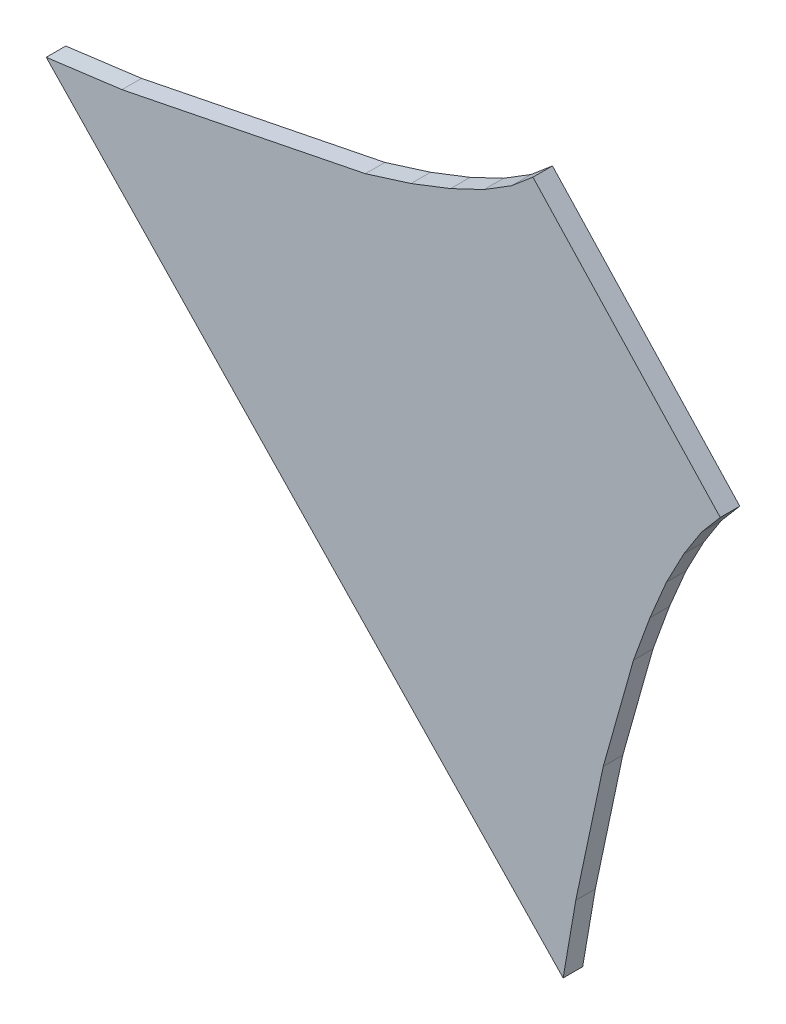
ISO-10303-21;
HEADER;
FILE_DESCRIPTION(('STEP AP214'),'2;1');
FILE_NAME('part.step','',(''),(''),'','','');
FILE_SCHEMA(('AUTOMOTIVE_DESIGN { 1 0 10303 214 1 1 1 1 }'));
ENDSEC;
DATA;
#1=APPLICATION_CONTEXT('core data for automotive mechanical design processes');
#2=APPLICATION_PROTOCOL_DEFINITION('international standard','automotive_design',2000,#1);
#3=PRODUCT_CONTEXT('',#1,'mechanical');
#4=PRODUCT('Part','Part','',(#3));
#5=PRODUCT_RELATED_PRODUCT_CATEGORY('part','',(#4));
#6=PRODUCT_DEFINITION_FORMATION('','',#4);
#7=PRODUCT_DEFINITION_CONTEXT('part definition',#1,'design');
#8=PRODUCT_DEFINITION('design','',#6,#7);
#9=PRODUCT_DEFINITION_SHAPE('','',#8);
#10=(LENGTH_UNIT() NAMED_UNIT(*) SI_UNIT(.MILLI.,.METRE.));
#11=(NAMED_UNIT(*) PLANE_ANGLE_UNIT() SI_UNIT($,.RADIAN.));
#12=(NAMED_UNIT(*) SI_UNIT($,.STERADIAN.) SOLID_ANGLE_UNIT());
#13=UNCERTAINTY_MEASURE_WITH_UNIT(LENGTH_MEASURE(1.E-05),#10,'distance_accuracy_value','');
#14=(GEOMETRIC_REPRESENTATION_CONTEXT(3) GLOBAL_UNCERTAINTY_ASSIGNED_CONTEXT((#13)) GLOBAL_UNIT_ASSIGNED_CONTEXT((#10,
#11,#12)) REPRESENTATION_CONTEXT('',''));
#15=CARTESIAN_POINT('',(0.,0.,0.));
#16=DIRECTION('',(0.,0.,1.));
#17=DIRECTION('',(1.,0.,0.));
#18=AXIS2_PLACEMENT_3D('',#15,#16,#17);
#19=CARTESIAN_POINT('',(40.1839981079102,99.6380004882812,0.));
#20=DIRECTION('',(0.645932199012131,-0.76339478271688,0.));
#21=DIRECTION('',(-0.76339478271688,-0.645932199012131,0.));
#22=AXIS2_PLACEMENT_3D('',#19,#20,#21);
#23=PLANE('',#22);
#24=DIRECTION('',(-0.76339478271688,-0.645932199012131,0.));
#25=VECTOR('',#24,1.);
#26=CARTESIAN_POINT('',(40.1839981079102,99.6380004882812,0.03556));
#27=LINE('',#26,#25);
#28=CARTESIAN_POINT('',(40.1839981079102,99.6380004882812,0.03556));
#29=VERTEX_POINT('',#28);
#30=CARTESIAN_POINT('',(40.1450004577637,99.6050033569336,0.03556));
#31=VERTEX_POINT('',#30);
#32=EDGE_CURVE('E11',#29,#31,#27,.T.);
#33=ORIENTED_EDGE('',*,*,#32,.F.);
#34=DIRECTION('',(0.,0.,1.));
#35=VECTOR('',#34,1.);
#36=CARTESIAN_POINT('',(40.1839981079102,99.6380004882812,0.));
#37=LINE('',#36,#35);
#38=CARTESIAN_POINT('',(40.1839981079102,99.6380004882812,0.));
#39=VERTEX_POINT('',#38);
#40=EDGE_CURVE('E24',#39,#29,#37,.T.);
#41=ORIENTED_EDGE('',*,*,#40,.F.);
#42=DIRECTION('',(-0.76339478271688,-0.645932199012131,0.));
#43=VECTOR('',#42,1.);
#44=CARTESIAN_POINT('',(40.1839981079102,99.6380004882812,0.));
#45=LINE('',#44,#43);
#46=CARTESIAN_POINT('',(40.1450004577637,99.6050033569336,0.));
#47=VERTEX_POINT('',#46);
#48=EDGE_CURVE('E154',#39,#47,#45,.T.);
#49=ORIENTED_EDGE('',*,*,#48,.T.);
#50=DIRECTION('',(0.,0.,1.));
#51=VECTOR('',#50,1.);
#52=CARTESIAN_POINT('',(40.1450004577637,99.6050033569336,0.));
#53=LINE('',#52,#51);
#54=EDGE_CURVE('E37',#47,#31,#53,.T.);
#55=ORIENTED_EDGE('',*,*,#54,.T.);
#56=EDGE_LOOP('',(#33,#41,#49,#55));
#57=FACE_BOUND('',#56,.T.);
#58=ADVANCED_FACE('F17',(#57),#23,.F.);
#59=CARTESIAN_POINT('',(40.1450004577637,99.6050033569336,0.));
#60=DIRECTION('',(0.527017414395951,-0.849854484558037,0.));
#61=DIRECTION('',(-0.849854484558037,-0.527017414395951,0.));
#62=AXIS2_PLACEMENT_3D('',#59,#60,#61);
#63=PLANE('',#62);
#64=DIRECTION('',(-0.849854484558037,-0.527017414395951,0.));
#65=VECTOR('',#64,1.);
#66=CARTESIAN_POINT('',(40.1450004577637,99.6050033569336,0.03556));
#67=LINE('',#66,#65);
#68=CARTESIAN_POINT('',(40.0950012207031,99.5739974975586,0.03556));
#69=VERTEX_POINT('',#68);
#70=EDGE_CURVE('E266',#31,#69,#67,.T.);
#71=ORIENTED_EDGE('',*,*,#70,.F.);
#72=ORIENTED_EDGE('',*,*,#54,.F.);
#73=DIRECTION('',(-0.849854484558037,-0.527017414395951,0.));
#74=VECTOR('',#73,1.);
#75=CARTESIAN_POINT('',(40.1450004577637,99.6050033569336,0.));
#76=LINE('',#75,#74);
#77=CARTESIAN_POINT('',(40.0950012207031,99.5739974975586,0.));
#78=VERTEX_POINT('',#77);
#79=EDGE_CURVE('E263',#47,#78,#76,.T.);
#80=ORIENTED_EDGE('',*,*,#79,.T.);
#81=DIRECTION('',(0.,0.,1.));
#82=VECTOR('',#81,1.);
#83=CARTESIAN_POINT('',(40.0950012207031,99.5739974975586,0.));
#84=LINE('',#83,#82);
#85=EDGE_CURVE('E261',#78,#69,#84,.T.);
#86=ORIENTED_EDGE('',*,*,#85,.T.);
#87=EDGE_LOOP('',(#71,#72,#80,#86));
#88=FACE_BOUND('',#87,.T.);
#89=ADVANCED_FACE('F274',(#88),#63,.F.);
#90=CARTESIAN_POINT('',(40.0950012207031,99.5739974975586,0.));
#91=DIRECTION('',(0.429345950858974,-0.903140107890799,0.));
#92=DIRECTION('',(-0.903140107890799,-0.429345950858974,0.));
#93=AXIS2_PLACEMENT_3D('',#90,#91,#92);
#94=PLANE('',#93);
#95=DIRECTION('',(-0.903140107890799,-0.429345950858974,0.));
#96=VECTOR('',#95,1.);
#97=CARTESIAN_POINT('',(40.0950012207031,99.5739974975586,0.03556));
#98=LINE('',#97,#96);
#99=CARTESIAN_POINT('',(40.0340003967285,99.5449981689453,0.03556));
#100=VERTEX_POINT('',#99);
#101=EDGE_CURVE('E258',#69,#100,#98,.T.);
#102=ORIENTED_EDGE('',*,*,#101,.F.);
#103=ORIENTED_EDGE('',*,*,#85,.F.);
#104=DIRECTION('',(-0.903140107890799,-0.429345950858974,0.));
#105=VECTOR('',#104,1.);
#106=CARTESIAN_POINT('',(40.0950012207031,99.5739974975586,0.));
#107=LINE('',#106,#105);
#108=CARTESIAN_POINT('',(40.0340003967285,99.5449981689453,0.));
#109=VERTEX_POINT('',#108);
#110=EDGE_CURVE('E255',#78,#109,#107,.T.);
#111=ORIENTED_EDGE('',*,*,#110,.T.);
#112=DIRECTION('',(0.,0.,1.));
#113=VECTOR('',#112,1.);
#114=CARTESIAN_POINT('',(40.0340003967285,99.5449981689453,0.));
#115=LINE('',#114,#113);
#116=EDGE_CURVE('E253',#109,#100,#115,.T.);
#117=ORIENTED_EDGE('',*,*,#116,.T.);
#118=EDGE_LOOP('',(#102,#103,#111,#117));
#119=FACE_BOUND('',#118,.T.);
#120=ADVANCED_FACE('F280',(#119),#94,.F.);
#121=CARTESIAN_POINT('',(40.0340003967285,99.5449981689453,0.));
#122=DIRECTION('',(0.362451027072357,-0.932002818114942,0.));
#123=DIRECTION('',(-0.932002818114942,-0.362451027072357,0.));
#124=AXIS2_PLACEMENT_3D('',#121,#122,#123);
#125=PLANE('',#124);
#126=DIRECTION('',(-0.932002818114942,-0.362451027072357,0.));
#127=VECTOR('',#126,1.);
#128=CARTESIAN_POINT('',(40.0340003967285,99.5449981689453,0.03556));
#129=LINE('',#128,#127);
#130=CARTESIAN_POINT('',(39.9620018005371,99.5169982910156,0.03556));
#131=VERTEX_POINT('',#130);
#132=EDGE_CURVE('E250',#100,#131,#129,.T.);
#133=ORIENTED_EDGE('',*,*,#132,.F.);
#134=ORIENTED_EDGE('',*,*,#116,.F.);
#135=DIRECTION('',(-0.932002818114942,-0.362451027072357,0.));
#136=VECTOR('',#135,1.);
#137=CARTESIAN_POINT('',(40.0340003967285,99.5449981689453,0.));
#138=LINE('',#137,#136);
#139=CARTESIAN_POINT('',(39.9620018005371,99.5169982910156,0.));
#140=VERTEX_POINT('',#139);
#141=EDGE_CURVE('E247',#109,#140,#138,.T.);
#142=ORIENTED_EDGE('',*,*,#141,.T.);
#143=DIRECTION('',(0.,0.,1.));
#144=VECTOR('',#143,1.);
#145=CARTESIAN_POINT('',(39.9620018005371,99.5169982910156,0.));
#146=LINE('',#145,#144);
#147=EDGE_CURVE('E245',#140,#131,#146,.T.);
#148=ORIENTED_EDGE('',*,*,#147,.T.);
#149=EDGE_LOOP('',(#133,#134,#142,#148));
#150=FACE_BOUND('',#149,.T.);
#151=ADVANCED_FACE('F282',(#150),#125,.F.);
#152=CARTESIAN_POINT('',(39.9620018005371,99.5169982910156,0.));
#153=DIRECTION('',(0.298939196929958,-0.954272160622363,0.));
#154=DIRECTION('',(-0.954272160622363,-0.298939196929958,0.));
#155=AXIS2_PLACEMENT_3D('',#152,#153,#154);
#156=PLANE('',#155);
#157=DIRECTION('',(-0.954272160622362,-0.298939196929958,0.));
#158=VECTOR('',#157,1.);
#159=CARTESIAN_POINT('',(39.9620018005371,99.5169982910156,0.03556));
#160=LINE('',#159,#158);
#161=CARTESIAN_POINT('',(39.8790016174316,99.4909973144531,0.03556));
#162=VERTEX_POINT('',#161);
#163=EDGE_CURVE('E242',#131,#162,#160,.T.);
#164=ORIENTED_EDGE('',*,*,#163,.F.);
#165=ORIENTED_EDGE('',*,*,#147,.F.);
#166=DIRECTION('',(-0.954272160622362,-0.298939196929958,0.));
#167=VECTOR('',#166,1.);
#168=CARTESIAN_POINT('',(39.9620018005371,99.5169982910156,0.));
#169=LINE('',#168,#167);
#170=CARTESIAN_POINT('',(39.8790016174316,99.4909973144531,0.));
#171=VERTEX_POINT('',#170);
#172=EDGE_CURVE('E239',#140,#171,#169,.T.);
#173=ORIENTED_EDGE('',*,*,#172,.T.);
#174=DIRECTION('',(0.,0.,1.));
#175=VECTOR('',#174,1.);
#176=CARTESIAN_POINT('',(39.8790016174316,99.4909973144531,0.));
#177=LINE('',#176,#175);
#178=EDGE_CURVE('E237',#171,#162,#177,.T.);
#179=ORIENTED_EDGE('',*,*,#178,.T.);
#180=EDGE_LOOP('',(#164,#165,#173,#179));
#181=FACE_BOUND('',#180,.T.);
#182=ADVANCED_FACE('F287',(#181),#156,.F.);
#183=CARTESIAN_POINT('',(39.8790016174317,99.4909973144531,0.));
#184=DIRECTION('',(0.196960298623905,-0.980411465031893,0.));
#185=DIRECTION('',(-0.980411465031893,-0.196960298623905,0.));
#186=AXIS2_PLACEMENT_3D('',#183,#184,#185);
#187=PLANE('',#186);
#188=DIRECTION('',(-0.980411465031893,-0.196960298623905,0.));
#189=VECTOR('',#188,1.);
#190=CARTESIAN_POINT('',(39.8790016174316,99.4909973144531,0.03556));
#191=LINE('',#190,#189);
#192=CARTESIAN_POINT('',(39.4360008239746,99.4020004272461,0.03556));
#193=VERTEX_POINT('',#192);
#194=EDGE_CURVE('E234',#162,#193,#191,.T.);
#195=ORIENTED_EDGE('',*,*,#194,.F.);
#196=ORIENTED_EDGE('',*,*,#178,.F.);
#197=DIRECTION('',(-0.980411465031893,-0.196960298623905,0.));
#198=VECTOR('',#197,1.);
#199=CARTESIAN_POINT('',(39.8790016174316,99.4909973144531,0.));
#200=LINE('',#199,#198);
#201=CARTESIAN_POINT('',(39.4360008239746,99.4020004272461,0.));
#202=VERTEX_POINT('',#201);
#203=EDGE_CURVE('E231',#171,#202,#200,.T.);
#204=ORIENTED_EDGE('',*,*,#203,.T.);
#205=DIRECTION('',(0.,0.,1.));
#206=VECTOR('',#205,1.);
#207=CARTESIAN_POINT('',(39.4360008239746,99.4020004272461,0.));
#208=LINE('',#207,#206);
#209=EDGE_CURVE('E229',#202,#193,#208,.T.);
#210=ORIENTED_EDGE('',*,*,#209,.T.);
#211=EDGE_LOOP('',(#195,#196,#204,#210));
#212=FACE_BOUND('',#211,.T.);
#213=ADVANCED_FACE('F290',(#212),#187,.F.);
#214=CARTESIAN_POINT('',(39.4360008239746,99.4020004272461,0.));
#215=DIRECTION('',(0.129322778504163,-0.991602550904324,0.));
#216=DIRECTION('',(-0.991602550904324,-0.129322778504163,0.));
#217=AXIS2_PLACEMENT_3D('',#214,#215,#216);
#218=PLANE('',#217);
#219=DIRECTION('',(-0.991602550904324,-0.129322778504163,0.));
#220=VECTOR('',#219,1.);
#221=CARTESIAN_POINT('',(39.4360008239746,99.4020004272461,0.03556));
#222=LINE('',#221,#220);
#223=CARTESIAN_POINT('',(39.2980003356934,99.3840026855469,0.03556));
#224=VERTEX_POINT('',#223);
#225=EDGE_CURVE('E226',#193,#224,#222,.T.);
#226=ORIENTED_EDGE('',*,*,#225,.F.);
#227=ORIENTED_EDGE('',*,*,#209,.F.);
#228=DIRECTION('',(-0.991602550904324,-0.129322778504163,0.));
#229=VECTOR('',#228,1.);
#230=CARTESIAN_POINT('',(39.4360008239746,99.4020004272461,0.));
#231=LINE('',#230,#229);
#232=CARTESIAN_POINT('',(39.2980003356934,99.3840026855469,0.));
#233=VERTEX_POINT('',#232);
#234=EDGE_CURVE('E223',#202,#233,#231,.T.);
#235=ORIENTED_EDGE('',*,*,#234,.T.);
#236=DIRECTION('',(0.,0.,1.));
#237=VECTOR('',#236,1.);
#238=CARTESIAN_POINT('',(39.2980003356934,99.3840026855469,0.));
#239=LINE('',#238,#237);
#240=EDGE_CURVE('E221',#233,#224,#239,.T.);
#241=ORIENTED_EDGE('',*,*,#240,.T.);
#242=EDGE_LOOP('',(#226,#227,#235,#241));
#243=FACE_BOUND('',#242,.T.);
#244=ADVANCED_FACE('F295',(#243),#218,.F.);
#245=CARTESIAN_POINT('',(39.2980003356934,99.3840026855469,0.));
#246=DIRECTION('',(0.721668270543544,0.692239053572312,0.));
#247=DIRECTION('',(0.692239053572312,-0.721668270543544,0.));
#248=AXIS2_PLACEMENT_3D('',#245,#246,#247);
#249=PLANE('',#248);
#250=DIRECTION('',(0.692239053572312,-0.721668270543544,0.));
#251=VECTOR('',#250,1.);
#252=CARTESIAN_POINT('',(39.2980003356934,99.3840026855469,0.03556));
#253=LINE('',#252,#251);
#254=CARTESIAN_POINT('',(40.2389984130859,98.4029998779297,0.03556));
#255=VERTEX_POINT('',#254);
#256=EDGE_CURVE('E218',#224,#255,#253,.T.);
#257=ORIENTED_EDGE('',*,*,#256,.F.);
#258=ORIENTED_EDGE('',*,*,#240,.F.);
#259=DIRECTION('',(0.692239053572312,-0.721668270543544,0.));
#260=VECTOR('',#259,1.);
#261=CARTESIAN_POINT('',(39.2980003356934,99.3840026855469,0.));
#262=LINE('',#261,#260);
#263=CARTESIAN_POINT('',(40.2389984130859,98.4029998779297,0.));
#264=VERTEX_POINT('',#263);
#265=EDGE_CURVE('E215',#233,#264,#262,.T.);
#266=ORIENTED_EDGE('',*,*,#265,.T.);
#267=DIRECTION('',(0.,0.,1.));
#268=VECTOR('',#267,1.);
#269=CARTESIAN_POINT('',(40.2389984130859,98.4029998779297,0.));
#270=LINE('',#269,#268);
#271=EDGE_CURVE('E213',#264,#255,#270,.T.);
#272=ORIENTED_EDGE('',*,*,#271,.T.);
#273=EDGE_LOOP('',(#257,#258,#266,#272));
#274=FACE_BOUND('',#273,.T.);
#275=ADVANCED_FACE('F298',(#274),#249,.F.);
#276=CARTESIAN_POINT('',(40.2389984130859,98.4029998779297,0.));
#277=DIRECTION('',(-0.985584583749153,0.169183416078553,0.));
#278=DIRECTION('',(0.169183416078553,0.985584583749153,0.));
#279=AXIS2_PLACEMENT_3D('',#276,#277,#278);
#280=PLANE('',#279);
#281=DIRECTION('',(0.169183416078553,0.985584583749153,0.));
#282=VECTOR('',#281,1.);
#283=CARTESIAN_POINT('',(40.2389984130859,98.4029998779297,0.03556));
#284=LINE('',#283,#282);
#285=CARTESIAN_POINT('',(40.2620010375976,98.5370025634766,0.03556));
#286=VERTEX_POINT('',#285);
#287=EDGE_CURVE('E210',#255,#286,#284,.T.);
#288=ORIENTED_EDGE('',*,*,#287,.F.);
#289=ORIENTED_EDGE('',*,*,#271,.F.);
#290=DIRECTION('',(0.169183416078553,0.985584583749153,0.));
#291=VECTOR('',#290,1.);
#292=CARTESIAN_POINT('',(40.2389984130859,98.4029998779297,0.));
#293=LINE('',#292,#291);
#294=CARTESIAN_POINT('',(40.2620010375976,98.5370025634766,0.));
#295=VERTEX_POINT('',#294);
#296=EDGE_CURVE('E207',#264,#295,#293,.T.);
#297=ORIENTED_EDGE('',*,*,#296,.T.);
#298=DIRECTION('',(0.,0.,1.));
#299=VECTOR('',#298,1.);
#300=CARTESIAN_POINT('',(40.2620010375976,98.5370025634766,0.));
#301=LINE('',#300,#299);
#302=EDGE_CURVE('E205',#295,#286,#301,.T.);
#303=ORIENTED_EDGE('',*,*,#302,.T.);
#304=EDGE_LOOP('',(#288,#289,#297,#303));
#305=FACE_BOUND('',#304,.T.);
#306=ADVANCED_FACE('F303',(#305),#280,.F.);
#307=CARTESIAN_POINT('',(40.2620010375977,98.5370025634766,0.));
#308=DIRECTION('',(-0.978285744045442,0.207260712624117,0.));
#309=DIRECTION('',(0.207260712624117,0.978285744045442,0.));
#310=AXIS2_PLACEMENT_3D('',#307,#308,#309);
#311=PLANE('',#310);
#312=DIRECTION('',(0.207260712624117,0.978285744045442,0.));
#313=VECTOR('',#312,1.);
#314=CARTESIAN_POINT('',(40.2620010375976,98.5370025634766,0.03556));
#315=LINE('',#314,#313);
#316=CARTESIAN_POINT('',(40.3120002746582,98.7730026245117,0.03556));
#317=VERTEX_POINT('',#316);
#318=EDGE_CURVE('E202',#286,#317,#315,.T.);
#319=ORIENTED_EDGE('',*,*,#318,.F.);
#320=ORIENTED_EDGE('',*,*,#302,.F.);
#321=DIRECTION('',(0.207260712624117,0.978285744045442,0.));
#322=VECTOR('',#321,1.);
#323=CARTESIAN_POINT('',(40.2620010375976,98.5370025634766,0.));
#324=LINE('',#323,#322);
#325=CARTESIAN_POINT('',(40.3120002746582,98.7730026245117,0.));
#326=VERTEX_POINT('',#325);
#327=EDGE_CURVE('E199',#295,#326,#324,.T.);
#328=ORIENTED_EDGE('',*,*,#327,.T.);
#329=DIRECTION('',(0.,0.,1.));
#330=VECTOR('',#329,1.);
#331=CARTESIAN_POINT('',(40.3120002746582,98.7730026245117,0.));
#332=LINE('',#331,#330);
#333=EDGE_CURVE('E197',#326,#317,#332,.T.);
#334=ORIENTED_EDGE('',*,*,#333,.T.);
#335=EDGE_LOOP('',(#319,#320,#328,#334));
#336=FACE_BOUND('',#335,.T.);
#337=ADVANCED_FACE('F306',(#336),#311,.F.);
#338=CARTESIAN_POINT('',(40.3120002746582,98.7730026245117,0.));
#339=DIRECTION('',(-0.962449171458833,0.271461953795013,0.));
#340=DIRECTION('',(0.271461953795013,0.962449171458833,0.));
#341=AXIS2_PLACEMENT_3D('',#338,#339,#340);
#342=PLANE('',#341);
#343=DIRECTION('',(0.271461953795013,0.962449171458833,0.));
#344=VECTOR('',#343,1.);
#345=CARTESIAN_POINT('',(40.3120002746582,98.7730026245117,0.03556));
#346=LINE('',#345,#344);
#347=CARTESIAN_POINT('',(40.367000579834,98.9680023193359,0.03556));
#348=VERTEX_POINT('',#347);
#349=EDGE_CURVE('E194',#317,#348,#346,.T.);
#350=ORIENTED_EDGE('',*,*,#349,.F.);
#351=ORIENTED_EDGE('',*,*,#333,.F.);
#352=DIRECTION('',(0.271461953795013,0.962449171458833,0.));
#353=VECTOR('',#352,1.);
#354=CARTESIAN_POINT('',(40.3120002746582,98.7730026245117,0.));
#355=LINE('',#354,#353);
#356=CARTESIAN_POINT('',(40.367000579834,98.9680023193359,0.));
#357=VERTEX_POINT('',#356);
#358=EDGE_CURVE('E191',#326,#357,#355,.T.);
#359=ORIENTED_EDGE('',*,*,#358,.T.);
#360=DIRECTION('',(0.,0.,1.));
#361=VECTOR('',#360,1.);
#362=CARTESIAN_POINT('',(40.367000579834,98.9680023193359,0.));
#363=LINE('',#362,#361);
#364=EDGE_CURVE('E189',#357,#348,#363,.T.);
#365=ORIENTED_EDGE('',*,*,#364,.T.);
#366=EDGE_LOOP('',(#350,#351,#359,#365));
#367=FACE_BOUND('',#366,.T.);
#368=ADVANCED_FACE('F311',(#367),#342,.F.);
#369=CARTESIAN_POINT('',(40.367000579834,98.968002319336,0.));
#370=DIRECTION('',(-0.939128353177272,0.343566494668128,0.));
#371=DIRECTION('',(0.343566494668128,0.939128353177272,0.));
#372=AXIS2_PLACEMENT_3D('',#369,#370,#371);
#373=PLANE('',#372);
#374=DIRECTION('',(0.343566494668128,0.939128353177272,0.));
#375=VECTOR('',#374,1.);
#376=CARTESIAN_POINT('',(40.367000579834,98.9680023193359,0.03556));
#377=LINE('',#376,#375);
#378=CARTESIAN_POINT('',(40.3969993591309,99.0500030517578,0.03556));
#379=VERTEX_POINT('',#378);
#380=EDGE_CURVE('E186',#348,#379,#377,.T.);
#381=ORIENTED_EDGE('',*,*,#380,.F.);
#382=ORIENTED_EDGE('',*,*,#364,.F.);
#383=DIRECTION('',(0.343566494668128,0.939128353177272,0.));
#384=VECTOR('',#383,1.);
#385=CARTESIAN_POINT('',(40.367000579834,98.9680023193359,0.));
#386=LINE('',#385,#384);
#387=CARTESIAN_POINT('',(40.3969993591309,99.0500030517578,0.));
#388=VERTEX_POINT('',#387);
#389=EDGE_CURVE('E183',#357,#388,#386,.T.);
#390=ORIENTED_EDGE('',*,*,#389,.T.);
#391=DIRECTION('',(0.,0.,1.));
#392=VECTOR('',#391,1.);
#393=CARTESIAN_POINT('',(40.3969993591309,99.0500030517578,0.));
#394=LINE('',#393,#392);
#395=EDGE_CURVE('E181',#388,#379,#394,.T.);
#396=ORIENTED_EDGE('',*,*,#395,.T.);
#397=EDGE_LOOP('',(#381,#382,#390,#396));
#398=FACE_BOUND('',#397,.T.);
#399=ADVANCED_FACE('F314',(#398),#373,.F.);
#400=CARTESIAN_POINT('',(40.3969993591309,99.0500030517578,0.));
#401=DIRECTION('',(-0.921150214947862,0.389207247493552,0.));
#402=DIRECTION('',(0.389207247493552,0.921150214947862,0.));
#403=AXIS2_PLACEMENT_3D('',#400,#401,#402);
#404=PLANE('',#403);
#405=DIRECTION('',(0.389207247493552,0.921150214947862,0.));
#406=VECTOR('',#405,1.);
#407=CARTESIAN_POINT('',(40.3969993591309,99.0500030517578,0.03556));
#408=LINE('',#407,#406);
#409=CARTESIAN_POINT('',(40.4269981384277,99.1210021972656,0.03556));
#410=VERTEX_POINT('',#409);
#411=EDGE_CURVE('E178',#379,#410,#408,.T.);
#412=ORIENTED_EDGE('',*,*,#411,.F.);
#413=ORIENTED_EDGE('',*,*,#395,.F.);
#414=DIRECTION('',(0.389207247493552,0.921150214947862,0.));
#415=VECTOR('',#414,1.);
#416=CARTESIAN_POINT('',(40.3969993591309,99.0500030517578,0.));
#417=LINE('',#416,#415);
#418=CARTESIAN_POINT('',(40.4269981384277,99.1210021972656,0.));
#419=VERTEX_POINT('',#418);
#420=EDGE_CURVE('E175',#388,#419,#417,.T.);
#421=ORIENTED_EDGE('',*,*,#420,.T.);
#422=DIRECTION('',(0.,0.,1.));
#423=VECTOR('',#422,1.);
#424=CARTESIAN_POINT('',(40.4269981384277,99.1210021972656,0.));
#425=LINE('',#424,#423);
#426=EDGE_CURVE('E173',#419,#410,#425,.T.);
#427=ORIENTED_EDGE('',*,*,#426,.T.);
#428=EDGE_LOOP('',(#412,#413,#421,#427));
#429=FACE_BOUND('',#428,.T.);
#430=ADVANCED_FACE('F319',(#429),#404,.F.);
#431=CARTESIAN_POINT('',(40.4269981384277,99.1210021972656,0.));
#432=DIRECTION('',(-0.885528924101211,0.46458424917355,0.));
#433=DIRECTION('',(0.46458424917355,0.885528924101211,0.));
#434=AXIS2_PLACEMENT_3D('',#431,#432,#433);
#435=PLANE('',#434);
#436=DIRECTION('',(0.46458424917355,0.885528924101211,0.));
#437=VECTOR('',#436,1.);
#438=CARTESIAN_POINT('',(40.4269981384277,99.1210021972656,0.03556));
#439=LINE('',#438,#437);
#440=CARTESIAN_POINT('',(40.4589996337891,99.181999206543,0.03556));
#441=VERTEX_POINT('',#440);
#442=EDGE_CURVE('E170',#410,#441,#439,.T.);
#443=ORIENTED_EDGE('',*,*,#442,.F.);
#444=ORIENTED_EDGE('',*,*,#426,.F.);
#445=DIRECTION('',(0.46458424917355,0.885528924101211,0.));
#446=VECTOR('',#445,1.);
#447=CARTESIAN_POINT('',(40.4269981384277,99.1210021972656,0.));
#448=LINE('',#447,#446);
#449=CARTESIAN_POINT('',(40.4589996337891,99.181999206543,0.));
#450=VERTEX_POINT('',#449);
#451=EDGE_CURVE('E167',#419,#450,#448,.T.);
#452=ORIENTED_EDGE('',*,*,#451,.T.);
#453=DIRECTION('',(0.,0.,1.));
#454=VECTOR('',#453,1.);
#455=CARTESIAN_POINT('',(40.4589996337891,99.181999206543,0.));
#456=LINE('',#455,#454);
#457=EDGE_CURVE('E165',#450,#441,#456,.T.);
#458=ORIENTED_EDGE('',*,*,#457,.T.);
#459=EDGE_LOOP('',(#443,#444,#452,#458));
#460=FACE_BOUND('',#459,.T.);
#461=ADVANCED_FACE('F322',(#460),#435,.F.);
#462=CARTESIAN_POINT('',(40.4589996337891,99.181999206543,0.));
#463=DIRECTION('',(-0.842274901568336,0.539048226217331,0.));
#464=DIRECTION('',(0.539048226217331,0.842274901568336,0.));
#465=AXIS2_PLACEMENT_3D('',#462,#463,#464);
#466=PLANE('',#465);
#467=DIRECTION('',(0.539048226217331,0.842274901568336,0.));
#468=VECTOR('',#467,1.);
#469=CARTESIAN_POINT('',(40.4589996337891,99.181999206543,0.03556));
#470=LINE('',#469,#468);
#471=CARTESIAN_POINT('',(40.4910011291504,99.2320022583008,0.03556));
#472=VERTEX_POINT('',#471);
#473=EDGE_CURVE('E162',#441,#472,#470,.T.);
#474=ORIENTED_EDGE('',*,*,#473,.F.);
#475=ORIENTED_EDGE('',*,*,#457,.F.);
#476=DIRECTION('',(0.539048226217331,0.842274901568336,0.));
#477=VECTOR('',#476,1.);
#478=CARTESIAN_POINT('',(40.4589996337891,99.181999206543,0.));
#479=LINE('',#478,#477);
#480=CARTESIAN_POINT('',(40.4910011291504,99.2320022583008,0.));
#481=VERTEX_POINT('',#480);
#482=EDGE_CURVE('E160',#450,#481,#479,.T.);
#483=ORIENTED_EDGE('',*,*,#482,.T.);
#484=DIRECTION('',(0.,0.,1.));
#485=VECTOR('',#484,1.);
#486=CARTESIAN_POINT('',(40.4910011291504,99.2320022583008,0.));
#487=LINE('',#486,#485);
#488=EDGE_CURVE('E145',#481,#472,#487,.T.);
#489=ORIENTED_EDGE('',*,*,#488,.T.);
#490=EDGE_LOOP('',(#474,#475,#483,#489));
#491=FACE_BOUND('',#490,.T.);
#492=ADVANCED_FACE('F325',(#491),#466,.F.);
#493=CARTESIAN_POINT('',(40.4910011291504,99.2320022583008,0.));
#494=DIRECTION('',(-0.761942903433903,0.647644201631354,0.));
#495=DIRECTION('',(0.647644201631354,0.761942903433903,0.));
#496=AXIS2_PLACEMENT_3D('',#493,#494,#495);
#497=PLANE('',#496);
#498=DIRECTION('',(0.647644201631354,0.761942903433903,0.));
#499=VECTOR('',#498,1.);
#500=CARTESIAN_POINT('',(40.4910011291504,99.2320022583008,0.03556));
#501=LINE('',#500,#499);
#502=CARTESIAN_POINT('',(40.5250015258789,99.2720031738281,0.03556));
#503=VERTEX_POINT('',#502);
#504=EDGE_CURVE('E149',#472,#503,#501,.T.);
#505=ORIENTED_EDGE('',*,*,#504,.F.);
#506=ORIENTED_EDGE('',*,*,#488,.F.);
#507=DIRECTION('',(0.647644201631354,0.761942903433903,0.));
#508=VECTOR('',#507,1.);
#509=CARTESIAN_POINT('',(40.4910011291504,99.2320022583008,0.));
#510=LINE('',#509,#508);
#511=CARTESIAN_POINT('',(40.5250015258789,99.2720031738281,0.));
#512=VERTEX_POINT('',#511);
#513=EDGE_CURVE('E141',#481,#512,#510,.T.);
#514=ORIENTED_EDGE('',*,*,#513,.T.);
#515=DIRECTION('',(0.,0.,1.));
#516=VECTOR('',#515,1.);
#517=CARTESIAN_POINT('',(40.5250015258789,99.2720031738281,0.));
#518=LINE('',#517,#516);
#519=EDGE_CURVE('E131',#512,#503,#518,.T.);
#520=ORIENTED_EDGE('',*,*,#519,.T.);
#521=EDGE_LOOP('',(#505,#506,#514,#520));
#522=FACE_BOUND('',#521,.T.);
#523=ADVANCED_FACE('F144',(#522),#497,.F.);
#524=CARTESIAN_POINT('',(40.5250015258789,99.2720031738281,0.));
#525=DIRECTION('',(-0.731647375983064,-0.681683296859398,0.));
#526=DIRECTION('',(-0.681683296859398,0.731647375983064,0.));
#527=AXIS2_PLACEMENT_3D('',#524,#525,#526);
#528=PLANE('',#527);
#529=DIRECTION('',(-0.681683296859397,0.731647375983064,0.));
#530=VECTOR('',#529,1.);
#531=CARTESIAN_POINT('',(40.5250015258789,99.2720031738281,0.03556));
#532=LINE('',#531,#530);
#533=EDGE_CURVE('E137',#503,#29,#532,.T.);
#534=ORIENTED_EDGE('',*,*,#533,.F.);
#535=ORIENTED_EDGE('',*,*,#519,.F.);
#536=DIRECTION('',(-0.681683296859397,0.731647375983064,0.));
#537=VECTOR('',#536,1.);
#538=CARTESIAN_POINT('',(40.5250015258789,99.2720031738281,0.));
#539=LINE('',#538,#537);
#540=EDGE_CURVE('E135',#512,#39,#539,.T.);
#541=ORIENTED_EDGE('',*,*,#540,.T.);
#542=ORIENTED_EDGE('',*,*,#40,.T.);
#543=EDGE_LOOP('',(#534,#535,#541,#542));
#544=FACE_BOUND('',#543,.T.);
#545=ADVANCED_FACE('F133',(#544),#528,.F.);
#546=CARTESIAN_POINT('',(40.1839981079102,99.6380004882812,0.));
#547=DIRECTION('',(0.,0.,1.));
#548=DIRECTION('',(1.,0.,0.));
#549=AXIS2_PLACEMENT_3D('',#546,#547,#548);
#550=PLANE('',#549);
#551=ORIENTED_EDGE('',*,*,#540,.F.);
#552=ORIENTED_EDGE('',*,*,#513,.F.);
#553=ORIENTED_EDGE('',*,*,#482,.F.);
#554=ORIENTED_EDGE('',*,*,#451,.F.);
#555=ORIENTED_EDGE('',*,*,#420,.F.);
#556=ORIENTED_EDGE('',*,*,#389,.F.);
#557=ORIENTED_EDGE('',*,*,#358,.F.);
#558=ORIENTED_EDGE('',*,*,#327,.F.);
#559=ORIENTED_EDGE('',*,*,#296,.F.);
#560=ORIENTED_EDGE('',*,*,#265,.F.);
#561=ORIENTED_EDGE('',*,*,#234,.F.);
#562=ORIENTED_EDGE('',*,*,#203,.F.);
#563=ORIENTED_EDGE('',*,*,#172,.F.);
#564=ORIENTED_EDGE('',*,*,#141,.F.);
#565=ORIENTED_EDGE('',*,*,#110,.F.);
#566=ORIENTED_EDGE('',*,*,#79,.F.);
#567=ORIENTED_EDGE('',*,*,#48,.F.);
#568=EDGE_LOOP('',(#551,#552,#553,#554,#555,#556,#557,#558,#559,#560,#561,#562,#563,#564,#565,
#566,#567));
#569=FACE_BOUND('',#568,.T.);
#570=ADVANCED_FACE('F152',(#569),#550,.F.);
#571=CARTESIAN_POINT('',(40.1839981079102,99.6380004882812,0.03556));
#572=DIRECTION('',(0.,0.,1.));
#573=DIRECTION('',(1.,0.,0.));
#574=AXIS2_PLACEMENT_3D('',#571,#572,#573);
#575=PLANE('',#574);
#576=ORIENTED_EDGE('',*,*,#32,.T.);
#577=ORIENTED_EDGE('',*,*,#70,.T.);
#578=ORIENTED_EDGE('',*,*,#101,.T.);
#579=ORIENTED_EDGE('',*,*,#132,.T.);
#580=ORIENTED_EDGE('',*,*,#163,.T.);
#581=ORIENTED_EDGE('',*,*,#194,.T.);
#582=ORIENTED_EDGE('',*,*,#225,.T.);
#583=ORIENTED_EDGE('',*,*,#256,.T.);
#584=ORIENTED_EDGE('',*,*,#287,.T.);
#585=ORIENTED_EDGE('',*,*,#318,.T.);
#586=ORIENTED_EDGE('',*,*,#349,.T.);
#587=ORIENTED_EDGE('',*,*,#380,.T.);
#588=ORIENTED_EDGE('',*,*,#411,.T.);
#589=ORIENTED_EDGE('',*,*,#442,.T.);
#590=ORIENTED_EDGE('',*,*,#473,.T.);
#591=ORIENTED_EDGE('',*,*,#504,.T.);
#592=ORIENTED_EDGE('',*,*,#533,.T.);
#593=EDGE_LOOP('',(#576,#577,#578,#579,#580,#581,#582,#583,#584,#585,#586,#587,#588,#589,#590,
#591,#592));
#594=FACE_BOUND('',#593,.T.);
#595=ADVANCED_FACE('F277',(#594),#575,.T.);
#596=CLOSED_SHELL('',(#58,#89,#120,#151,#182,#213,#244,#275,#306,#337,#368,#399,#430,#461,#492,
#523,#545,#570,#595));
#597=MANIFOLD_SOLID_BREP('B1',#596);
#598=ADVANCED_BREP_SHAPE_REPRESENTATION('',(#18,#597),#14);
#599=SHAPE_DEFINITION_REPRESENTATION(#9,#598);
ENDSEC;
END-ISO-10303-21;
